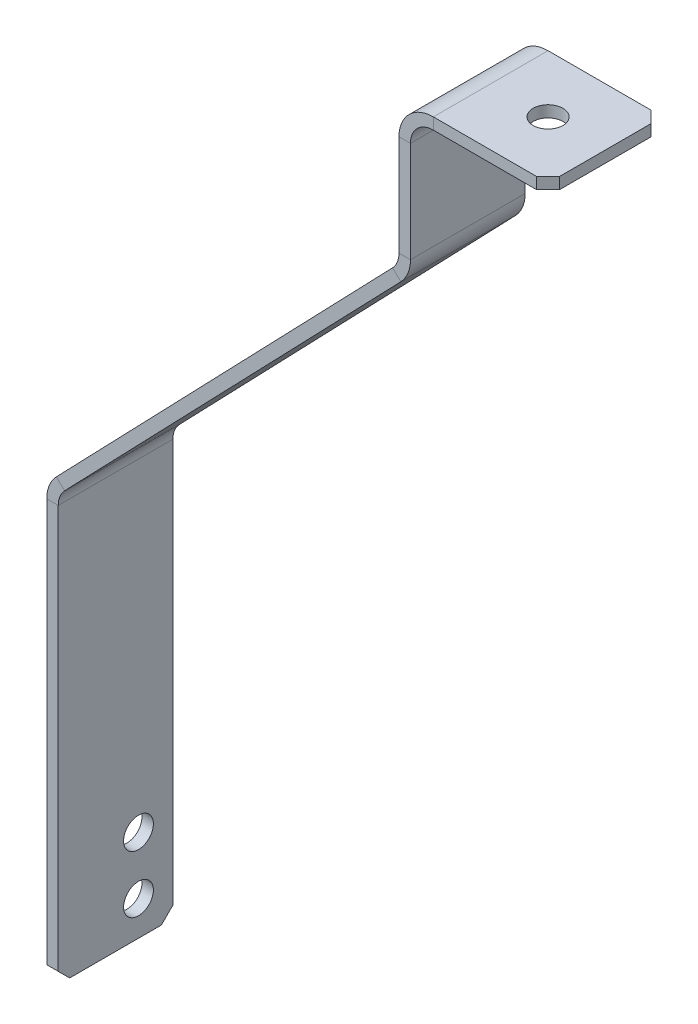
ISO-10303-21;
HEADER;
FILE_DESCRIPTION(('STEP AP214'),'2;1');
FILE_NAME('part.step','',(''),(''),'','','');
FILE_SCHEMA(('AUTOMOTIVE_DESIGN { 1 0 10303 214 1 1 1 1 }'));
ENDSEC;
DATA;
#1=APPLICATION_CONTEXT('core data for automotive mechanical design processes');
#2=APPLICATION_PROTOCOL_DEFINITION('international standard','automotive_design',2000,#1);
#3=PRODUCT_CONTEXT('',#1,'mechanical');
#4=PRODUCT('Part','Part','',(#3));
#5=PRODUCT_RELATED_PRODUCT_CATEGORY('part','',(#4));
#6=PRODUCT_DEFINITION_FORMATION('','',#4);
#7=PRODUCT_DEFINITION_CONTEXT('part definition',#1,'design');
#8=PRODUCT_DEFINITION('design','',#6,#7);
#9=PRODUCT_DEFINITION_SHAPE('','',#8);
#10=(LENGTH_UNIT() NAMED_UNIT(*) SI_UNIT(.MILLI.,.METRE.));
#11=(NAMED_UNIT(*) PLANE_ANGLE_UNIT() SI_UNIT($,.RADIAN.));
#12=(NAMED_UNIT(*) SI_UNIT($,.STERADIAN.) SOLID_ANGLE_UNIT());
#13=UNCERTAINTY_MEASURE_WITH_UNIT(LENGTH_MEASURE(1.E-05),#10,'distance_accuracy_value','');
#14=(GEOMETRIC_REPRESENTATION_CONTEXT(3) GLOBAL_UNCERTAINTY_ASSIGNED_CONTEXT((#13)) GLOBAL_UNIT_ASSIGNED_CONTEXT((#10,
#11,#12)) REPRESENTATION_CONTEXT('',''));
#15=CARTESIAN_POINT('',(0.,0.,0.));
#16=DIRECTION('',(0.,0.,1.));
#17=DIRECTION('',(1.,0.,0.));
#18=AXIS2_PLACEMENT_3D('',#15,#16,#17);
#19=CARTESIAN_POINT('',(153.6,394.5,50.));
#20=DIRECTION('',(0.,0.,1.));
#21=DIRECTION('',(1.,0.,0.));
#22=AXIS2_PLACEMENT_3D('',#19,#20,#21);
#23=PLANE('',#22);
#24=DIRECTION('',(-1.,0.,0.));
#25=VECTOR('',#24,1.);
#26=CARTESIAN_POINT('',(153.6,394.5,50.));
#27=LINE('',#26,#25);
#28=CARTESIAN_POINT('',(153.6,394.5,50.));
#29=VERTEX_POINT('',#28);
#30=CARTESIAN_POINT('',(148.6,394.5,50.));
#31=VERTEX_POINT('',#30);
#32=EDGE_CURVE('E344',#29,#31,#27,.T.);
#33=ORIENTED_EDGE('',*,*,#32,.F.);
#34=CARTESIAN_POINT('',(163.6,394.5,50.));
#35=DIRECTION('',(0.,0.,-1.));
#36=DIRECTION('',(-1.,0.,0.));
#37=AXIS2_PLACEMENT_3D('',#34,#35,#36);
#38=CIRCLE('',#37,10.);
#39=CARTESIAN_POINT('',(163.6,404.5,50.));
#40=VERTEX_POINT('',#39);
#41=EDGE_CURVE('E228',#40,#29,#38,.F.);
#42=ORIENTED_EDGE('',*,*,#41,.F.);
#43=DIRECTION('',(0.,-1.,0.));
#44=VECTOR('',#43,1.);
#45=CARTESIAN_POINT('',(163.6,409.5,50.));
#46=LINE('',#45,#44);
#47=CARTESIAN_POINT('',(163.6,409.5,50.));
#48=VERTEX_POINT('',#47);
#49=EDGE_CURVE('E341',#48,#40,#46,.T.);
#50=ORIENTED_EDGE('',*,*,#49,.F.);
#51=CARTESIAN_POINT('',(163.6,394.5,50.));
#52=DIRECTION('',(0.,0.,1.));
#53=DIRECTION('',(1.,0.,0.));
#54=AXIS2_PLACEMENT_3D('',#51,#52,#53);
#55=CIRCLE('',#54,15.);
#56=EDGE_CURVE('E235',#48,#31,#55,.T.);
#57=ORIENTED_EDGE('',*,*,#56,.T.);
#58=EDGE_LOOP('',(#33,#42,#50,#57));
#59=FACE_BOUND('',#58,.T.);
#60=ADVANCED_FACE('F47',(#59),#23,.T.);
#61=CARTESIAN_POINT('',(163.6,409.5,50.));
#62=DIRECTION('',(0.,0.,1.));
#63=DIRECTION('',(1.,0.,0.));
#64=AXIS2_PLACEMENT_3D('',#61,#62,#63);
#65=PLANE('',#64);
#66=DIRECTION('',(0.,-1.,0.));
#67=VECTOR('',#66,1.);
#68=CARTESIAN_POINT('',(153.6,404.5,50.));
#69=LINE('',#68,#67);
#70=CARTESIAN_POINT('',(153.6,350.548284887646,50.));
#71=VERTEX_POINT('',#70);
#72=EDGE_CURVE('E225',#29,#71,#69,.T.);
#73=ORIENTED_EDGE('',*,*,#72,.F.);
#74=ORIENTED_EDGE('',*,*,#32,.T.);
#75=DIRECTION('',(0.,1.,0.));
#76=VECTOR('',#75,1.);
#77=CARTESIAN_POINT('',(148.6,404.5,50.));
#78=LINE('',#77,#76);
#79=CARTESIAN_POINT('',(148.6,350.548284887646,50.));
#80=VERTEX_POINT('',#79);
#81=EDGE_CURVE('E238',#31,#80,#78,.F.);
#82=ORIENTED_EDGE('',*,*,#81,.T.);
#83=DIRECTION('',(1.,0.,0.));
#84=VECTOR('',#83,1.);
#85=CARTESIAN_POINT('',(148.6,350.548284887646,50.));
#86=LINE('',#85,#84);
#87=EDGE_CURVE('E332',#80,#71,#86,.T.);
#88=ORIENTED_EDGE('',*,*,#87,.T.);
#89=EDGE_LOOP('',(#73,#74,#82,#88));
#90=FACE_BOUND('',#89,.T.);
#91=ADVANCED_FACE('F493',(#90),#65,.T.);
#92=CARTESIAN_POINT('',(163.6,404.5,0.));
#93=DIRECTION('',(0.,0.,-1.));
#94=DIRECTION('',(-1.,0.,0.));
#95=AXIS2_PLACEMENT_3D('',#92,#93,#94);
#96=PLANE('',#95);
#97=DIRECTION('',(0.,1.,0.));
#98=VECTOR('',#97,1.);
#99=CARTESIAN_POINT('',(163.6,404.5,0.));
#100=LINE('',#99,#98);
#101=CARTESIAN_POINT('',(163.6,404.5,0.));
#102=VERTEX_POINT('',#101);
#103=CARTESIAN_POINT('',(163.6,409.5,0.));
#104=VERTEX_POINT('',#103);
#105=EDGE_CURVE('E338',#102,#104,#100,.T.);
#106=ORIENTED_EDGE('',*,*,#105,.F.);
#107=CARTESIAN_POINT('',(163.6,394.5,0.));
#108=DIRECTION('',(0.,0.,-1.));
#109=DIRECTION('',(-1.,0.,0.));
#110=AXIS2_PLACEMENT_3D('',#107,#108,#109);
#111=CIRCLE('',#110,10.);
#112=CARTESIAN_POINT('',(153.6,394.5,0.));
#113=VERTEX_POINT('',#112);
#114=EDGE_CURVE('E265',#102,#113,#111,.F.);
#115=ORIENTED_EDGE('',*,*,#114,.T.);
#116=DIRECTION('',(1.,0.,0.));
#117=VECTOR('',#116,1.);
#118=CARTESIAN_POINT('',(148.6,394.5,0.));
#119=LINE('',#118,#117);
#120=CARTESIAN_POINT('',(148.6,394.5,0.));
#121=VERTEX_POINT('',#120);
#122=EDGE_CURVE('E336',#121,#113,#119,.T.);
#123=ORIENTED_EDGE('',*,*,#122,.F.);
#124=CARTESIAN_POINT('',(163.6,394.5,0.));
#125=DIRECTION('',(0.,0.,1.));
#126=DIRECTION('',(1.,0.,0.));
#127=AXIS2_PLACEMENT_3D('',#124,#125,#126);
#128=CIRCLE('',#127,15.);
#129=EDGE_CURVE('E272',#104,#121,#128,.T.);
#130=ORIENTED_EDGE('',*,*,#129,.F.);
#131=EDGE_LOOP('',(#106,#115,#123,#130));
#132=FACE_BOUND('',#131,.T.);
#133=ADVANCED_FACE('F457',(#132),#96,.T.);
#134=CARTESIAN_POINT('',(148.6,394.5,0.));
#135=DIRECTION('',(0.,0.,-1.));
#136=DIRECTION('',(-1.,0.,0.));
#137=AXIS2_PLACEMENT_3D('',#134,#135,#136);
#138=PLANE('',#137);
#139=DIRECTION('',(-1.,0.,0.));
#140=VECTOR('',#139,1.);
#141=CARTESIAN_POINT('',(213.6,409.5,0.));
#142=LINE('',#141,#140);
#143=CARTESIAN_POINT('',(208.6,409.5,0.));
#144=VERTEX_POINT('',#143);
#145=EDGE_CURVE('E270',#144,#104,#142,.T.);
#146=ORIENTED_EDGE('',*,*,#145,.F.);
#147=DIRECTION('',(0.,-1.,0.));
#148=VECTOR('',#147,1.);
#149=CARTESIAN_POINT('',(208.6,394.5,0.));
#150=LINE('',#149,#148);
#151=CARTESIAN_POINT('',(208.6,404.5,0.));
#152=VERTEX_POINT('',#151);
#153=EDGE_CURVE('E346',#144,#152,#150,.T.);
#154=ORIENTED_EDGE('',*,*,#153,.T.);
#155=DIRECTION('',(-1.,0.,0.));
#156=VECTOR('',#155,1.);
#157=CARTESIAN_POINT('',(213.6,404.5,0.));
#158=LINE('',#157,#156);
#159=EDGE_CURVE('E268',#152,#102,#158,.T.);
#160=ORIENTED_EDGE('',*,*,#159,.T.);
#161=ORIENTED_EDGE('',*,*,#105,.T.);
#162=EDGE_LOOP('',(#146,#154,#160,#161));
#163=FACE_BOUND('',#162,.T.);
#164=ADVANCED_FACE('F451',(#163),#138,.T.);
#165=CARTESIAN_POINT('',(149.404552488393,340.143399231112,50.));
#166=DIRECTION('',(0.,0.,1.));
#167=DIRECTION('',(1.,0.,0.));
#168=AXIS2_PLACEMENT_3D('',#165,#166,#167);
#169=PLANE('',#168);
#170=DIRECTION('',(-0.72030349922622,0.693659043768956,0.));
#171=VECTOR('',#170,1.);
#172=CARTESIAN_POINT('',(149.404552488393,340.143399231112,50.));
#173=LINE('',#172,#171);
#174=CARTESIAN_POINT('',(149.404552488393,340.143399231112,50.));
#175=VERTEX_POINT('',#174);
#176=CARTESIAN_POINT('',(145.803034992262,343.611694449957,50.));
#177=VERTEX_POINT('',#176);
#178=EDGE_CURVE('E334',#175,#177,#173,.T.);
#179=ORIENTED_EDGE('',*,*,#178,.F.);
#180=CARTESIAN_POINT('',(138.6,350.548284887646,50.));
#181=DIRECTION('',(0.,0.,1.));
#182=DIRECTION('',(1.,0.,0.));
#183=AXIS2_PLACEMENT_3D('',#180,#181,#182);
#184=CIRCLE('',#183,15.);
#185=EDGE_CURVE('E219',#71,#175,#184,.F.);
#186=ORIENTED_EDGE('',*,*,#185,.F.);
#187=ORIENTED_EDGE('',*,*,#87,.F.);
#188=CARTESIAN_POINT('',(138.6,350.548284887646,50.));
#189=DIRECTION('',(0.,0.,1.));
#190=DIRECTION('',(1.,0.,0.));
#191=AXIS2_PLACEMENT_3D('',#188,#189,#190);
#192=CIRCLE('',#191,10.);
#193=EDGE_CURVE('E241',#80,#177,#192,.F.);
#194=ORIENTED_EDGE('',*,*,#193,.T.);
#195=EDGE_LOOP('',(#179,#186,#187,#194));
#196=FACE_BOUND('',#195,.T.);
#197=ADVANCED_FACE('F491',(#196),#169,.T.);
#198=CARTESIAN_POINT('',(148.6,350.548284887646,50.));
#199=DIRECTION('',(0.,0.,1.));
#200=DIRECTION('',(1.,0.,0.));
#201=AXIS2_PLACEMENT_3D('',#198,#199,#200);
#202=PLANE('',#201);
#203=DIRECTION('',(-0.693659043768952,-0.720303499226224,0.));
#204=VECTOR('',#203,1.);
#205=CARTESIAN_POINT('',(153.6,344.5,50.));
#206=LINE('',#205,#204);
#207=CARTESIAN_POINT('',(2.79696500773779,187.904400512592,50.));
#208=VERTEX_POINT('',#207);
#209=EDGE_CURVE('E217',#175,#208,#206,.T.);
#210=ORIENTED_EDGE('',*,*,#209,.F.);
#211=ORIENTED_EDGE('',*,*,#178,.T.);
#212=DIRECTION('',(-0.693659043768952,-0.720303499226224,0.));
#213=VECTOR('',#212,1.);
#214=CARTESIAN_POINT('',(149.998482503869,347.968295218845,50.));
#215=LINE('',#214,#213);
#216=CARTESIAN_POINT('',(-0.804552488393357,191.372695731437,50.));
#217=VERTEX_POINT('',#216);
#218=EDGE_CURVE('E244',#177,#217,#215,.T.);
#219=ORIENTED_EDGE('',*,*,#218,.T.);
#220=DIRECTION('',(0.720303499226224,-0.693659043768951,0.));
#221=VECTOR('',#220,1.);
#222=CARTESIAN_POINT('',(-0.804552488393357,191.372695731437,50.));
#223=LINE('',#222,#221);
#224=EDGE_CURVE('E194',#217,#208,#223,.T.);
#225=ORIENTED_EDGE('',*,*,#224,.T.);
#226=EDGE_LOOP('',(#210,#211,#219,#225));
#227=FACE_BOUND('',#226,.T.);
#228=ADVANCED_FACE('F773',(#227),#202,.T.);
#229=CARTESIAN_POINT('',(153.6,350.548284887646,0.));
#230=DIRECTION('',(0.,0.,-1.));
#231=DIRECTION('',(-1.,0.,0.));
#232=AXIS2_PLACEMENT_3D('',#229,#230,#231);
#233=PLANE('',#232);
#234=DIRECTION('',(-1.,0.,0.));
#235=VECTOR('',#234,1.);
#236=CARTESIAN_POINT('',(153.6,350.548284887646,0.));
#237=LINE('',#236,#235);
#238=CARTESIAN_POINT('',(153.6,350.548284887646,0.));
#239=VERTEX_POINT('',#238);
#240=CARTESIAN_POINT('',(148.6,350.548284887646,0.));
#241=VERTEX_POINT('',#240);
#242=EDGE_CURVE('E330',#239,#241,#237,.T.);
#243=ORIENTED_EDGE('',*,*,#242,.F.);
#244=CARTESIAN_POINT('',(138.6,350.548284887646,0.));
#245=DIRECTION('',(0.,0.,1.));
#246=DIRECTION('',(1.,0.,0.));
#247=AXIS2_PLACEMENT_3D('',#244,#245,#246);
#248=CIRCLE('',#247,15.);
#249=CARTESIAN_POINT('',(149.404552488393,340.143399231112,0.));
#250=VERTEX_POINT('',#249);
#251=EDGE_CURVE('E259',#239,#250,#248,.F.);
#252=ORIENTED_EDGE('',*,*,#251,.T.);
#253=DIRECTION('',(0.72030349922622,-0.693659043768956,0.));
#254=VECTOR('',#253,1.);
#255=CARTESIAN_POINT('',(145.803034992262,343.611694449957,0.));
#256=LINE('',#255,#254);
#257=CARTESIAN_POINT('',(145.803034992262,343.611694449957,0.));
#258=VERTEX_POINT('',#257);
#259=EDGE_CURVE('E193',#258,#250,#256,.T.);
#260=ORIENTED_EDGE('',*,*,#259,.F.);
#261=CARTESIAN_POINT('',(138.6,350.548284887646,0.));
#262=DIRECTION('',(0.,0.,1.));
#263=DIRECTION('',(1.,0.,0.));
#264=AXIS2_PLACEMENT_3D('',#261,#262,#263);
#265=CIRCLE('',#264,10.);
#266=EDGE_CURVE('E278',#241,#258,#265,.F.);
#267=ORIENTED_EDGE('',*,*,#266,.F.);
#268=EDGE_LOOP('',(#243,#252,#260,#267));
#269=FACE_BOUND('',#268,.T.);
#270=ADVANCED_FACE('F479',(#269),#233,.T.);
#271=CARTESIAN_POINT('',(145.803034992262,343.611694449957,0.));
#272=DIRECTION('',(0.,0.,-1.));
#273=DIRECTION('',(-1.,0.,0.));
#274=AXIS2_PLACEMENT_3D('',#271,#272,#273);
#275=PLANE('',#274);
#276=DIRECTION('',(0.,-1.,0.));
#277=VECTOR('',#276,1.);
#278=CARTESIAN_POINT('',(153.6,404.5,0.));
#279=LINE('',#278,#277);
#280=EDGE_CURVE('E262',#113,#239,#279,.T.);
#281=ORIENTED_EDGE('',*,*,#280,.T.);
#282=ORIENTED_EDGE('',*,*,#242,.T.);
#283=DIRECTION('',(0.,1.,0.));
#284=VECTOR('',#283,1.);
#285=CARTESIAN_POINT('',(148.6,404.5,0.));
#286=LINE('',#285,#284);
#287=EDGE_CURVE('E275',#121,#241,#286,.F.);
#288=ORIENTED_EDGE('',*,*,#287,.F.);
#289=ORIENTED_EDGE('',*,*,#122,.T.);
#290=EDGE_LOOP('',(#281,#282,#288,#289));
#291=FACE_BOUND('',#290,.T.);
#292=ADVANCED_FACE('F461',(#291),#275,.T.);
#293=CARTESIAN_POINT('',(0.,180.967810074903,50.));
#294=DIRECTION('',(0.,0.,1.));
#295=DIRECTION('',(1.,0.,0.));
#296=AXIS2_PLACEMENT_3D('',#293,#294,#295);
#297=PLANE('',#296);
#298=DIRECTION('',(-1.,0.,0.));
#299=VECTOR('',#298,1.);
#300=CARTESIAN_POINT('',(0.,180.967810074903,50.));
#301=LINE('',#300,#299);
#302=CARTESIAN_POINT('',(0.,180.967810074903,50.));
#303=VERTEX_POINT('',#302);
#304=CARTESIAN_POINT('',(-5.00000000000002,180.967810074903,50.));
#305=VERTEX_POINT('',#304);
#306=EDGE_CURVE('E184',#303,#305,#301,.T.);
#307=ORIENTED_EDGE('',*,*,#306,.F.);
#308=CARTESIAN_POINT('',(10.,180.967810074903,50.));
#309=DIRECTION('',(0.,0.,-1.));
#310=DIRECTION('',(-1.,0.,0.));
#311=AXIS2_PLACEMENT_3D('',#308,#309,#310);
#312=CIRCLE('',#311,10.);
#313=EDGE_CURVE('E188',#208,#303,#312,.F.);
#314=ORIENTED_EDGE('',*,*,#313,.F.);
#315=ORIENTED_EDGE('',*,*,#224,.F.);
#316=CARTESIAN_POINT('',(10.,180.967810074903,50.));
#317=DIRECTION('',(0.,0.,1.));
#318=DIRECTION('',(1.,0.,0.));
#319=AXIS2_PLACEMENT_3D('',#316,#317,#318);
#320=CIRCLE('',#319,15.);
#321=EDGE_CURVE('E191',#217,#305,#320,.T.);
#322=ORIENTED_EDGE('',*,*,#321,.T.);
#323=EDGE_LOOP('',(#307,#314,#315,#322));
#324=FACE_BOUND('',#323,.T.);
#325=ADVANCED_FACE('F186',(#324),#297,.T.);
#326=CARTESIAN_POINT('',(-0.804552488393357,191.372695731437,50.));
#327=DIRECTION('',(0.,0.,1.));
#328=DIRECTION('',(1.,0.,0.));
#329=AXIS2_PLACEMENT_3D('',#326,#327,#328);
#330=PLANE('',#329);
#331=DIRECTION('',(0.,-1.,0.));
#332=VECTOR('',#331,1.);
#333=CARTESIAN_POINT('',(-5.00000000000002,185.,50.));
#334=LINE('',#333,#332);
#335=CARTESIAN_POINT('',(-5.,5.,50.));
#336=VERTEX_POINT('',#335);
#337=EDGE_CURVE('E212',#305,#336,#334,.T.);
#338=ORIENTED_EDGE('',*,*,#337,.T.);
#339=DIRECTION('',(1.,0.,0.));
#340=VECTOR('',#339,1.);
#341=CARTESIAN_POINT('',(-0.804552488393357,5.,50.));
#342=LINE('',#341,#340);
#343=CARTESIAN_POINT('',(0.,5.,50.));
#344=VERTEX_POINT('',#343);
#345=EDGE_CURVE('E55',#336,#344,#342,.T.);
#346=ORIENTED_EDGE('',*,*,#345,.T.);
#347=DIRECTION('',(0.,-1.,0.));
#348=VECTOR('',#347,1.);
#349=CARTESIAN_POINT('',(0.,185.,50.));
#350=LINE('',#349,#348);
#351=EDGE_CURVE('E201',#303,#344,#350,.T.);
#352=ORIENTED_EDGE('',*,*,#351,.F.);
#353=ORIENTED_EDGE('',*,*,#306,.T.);
#354=EDGE_LOOP('',(#338,#346,#352,#353));
#355=FACE_BOUND('',#354,.T.);
#356=ADVANCED_FACE('F211',(#355),#330,.T.);
#357=CARTESIAN_POINT('',(2.79696500773779,187.904400512592,0.));
#358=DIRECTION('',(0.,0.,-1.));
#359=DIRECTION('',(-1.,0.,0.));
#360=AXIS2_PLACEMENT_3D('',#357,#358,#359);
#361=PLANE('',#360);
#362=DIRECTION('',(-0.720303499226224,0.693659043768951,0.));
#363=VECTOR('',#362,1.);
#364=CARTESIAN_POINT('',(2.79696500773779,187.904400512592,0.));
#365=LINE('',#364,#363);
#366=CARTESIAN_POINT('',(2.79696500773779,187.904400512592,0.));
#367=VERTEX_POINT('',#366);
#368=CARTESIAN_POINT('',(-0.804552488393357,191.372695731437,0.));
#369=VERTEX_POINT('',#368);
#370=EDGE_CURVE('E326',#367,#369,#365,.T.);
#371=ORIENTED_EDGE('',*,*,#370,.F.);
#372=CARTESIAN_POINT('',(10.,180.967810074903,0.));
#373=DIRECTION('',(0.,0.,-1.));
#374=DIRECTION('',(-1.,0.,0.));
#375=AXIS2_PLACEMENT_3D('',#372,#373,#374);
#376=CIRCLE('',#375,10.);
#377=CARTESIAN_POINT('',(0.,180.967810074903,0.));
#378=VERTEX_POINT('',#377);
#379=EDGE_CURVE('E254',#367,#378,#376,.F.);
#380=ORIENTED_EDGE('',*,*,#379,.T.);
#381=DIRECTION('',(1.,0.,0.));
#382=VECTOR('',#381,1.);
#383=CARTESIAN_POINT('',(-5.00000000000002,180.967810074903,0.));
#384=LINE('',#383,#382);
#385=CARTESIAN_POINT('',(-5.00000000000002,180.967810074903,0.));
#386=VERTEX_POINT('',#385);
#387=EDGE_CURVE('E324',#386,#378,#384,.T.);
#388=ORIENTED_EDGE('',*,*,#387,.F.);
#389=CARTESIAN_POINT('',(10.,180.967810074903,0.));
#390=DIRECTION('',(0.,0.,1.));
#391=DIRECTION('',(1.,0.,0.));
#392=AXIS2_PLACEMENT_3D('',#389,#390,#391);
#393=CIRCLE('',#392,15.);
#394=EDGE_CURVE('E284',#369,#386,#393,.T.);
#395=ORIENTED_EDGE('',*,*,#394,.F.);
#396=EDGE_LOOP('',(#371,#380,#388,#395));
#397=FACE_BOUND('',#396,.T.);
#398=ADVANCED_FACE('F402',(#397),#361,.T.);
#399=CARTESIAN_POINT('',(-5.00000000000002,180.967810074903,0.));
#400=DIRECTION('',(0.,0.,-1.));
#401=DIRECTION('',(-1.,0.,0.));
#402=AXIS2_PLACEMENT_3D('',#399,#400,#401);
#403=PLANE('',#402);
#404=DIRECTION('',(-0.693659043768952,-0.720303499226224,0.));
#405=VECTOR('',#404,1.);
#406=CARTESIAN_POINT('',(153.6,344.5,0.));
#407=LINE('',#406,#405);
#408=EDGE_CURVE('E256',#250,#367,#407,.T.);
#409=ORIENTED_EDGE('',*,*,#408,.T.);
#410=ORIENTED_EDGE('',*,*,#370,.T.);
#411=DIRECTION('',(-0.693659043768952,-0.720303499226224,0.));
#412=VECTOR('',#411,1.);
#413=CARTESIAN_POINT('',(149.998482503869,347.968295218845,0.));
#414=LINE('',#413,#412);
#415=EDGE_CURVE('E281',#258,#369,#414,.T.);
#416=ORIENTED_EDGE('',*,*,#415,.F.);
#417=ORIENTED_EDGE('',*,*,#259,.T.);
#418=EDGE_LOOP('',(#409,#410,#416,#417));
#419=FACE_BOUND('',#418,.T.);
#420=ADVANCED_FACE('F721',(#419),#403,.T.);
#421=CARTESIAN_POINT('',(-5.00000000000002,185.,50.));
#422=DIRECTION('',(1.,0.,0.));
#423=DIRECTION('',(0.,1.,0.));
#424=AXIS2_PLACEMENT_3D('',#421,#422,#423);
#425=PLANE('',#424);
#426=CARTESIAN_POINT('',(-5.,15.,15.));
#427=DIRECTION('',(-1.,0.,0.));
#428=DIRECTION('',(0.,-1.,0.));
#429=AXIS2_PLACEMENT_3D('',#426,#427,#428);
#430=CIRCLE('',#429,6.5);
#431=CARTESIAN_POINT('',(-5.,8.5,15.));
#432=VERTEX_POINT('',#431);
#433=EDGE_CURVE('E350',#432,#432,#430,.T.);
#434=ORIENTED_EDGE('',*,*,#433,.F.);
#435=EDGE_LOOP('',(#434));
#436=FACE_BOUND('',#435,.T.);
#437=CARTESIAN_POINT('',(-5.,40.,15.));
#438=DIRECTION('',(-1.,0.,0.));
#439=DIRECTION('',(0.,-1.,0.));
#440=AXIS2_PLACEMENT_3D('',#437,#438,#439);
#441=CIRCLE('',#440,6.5);
#442=CARTESIAN_POINT('',(-5.,33.5,15.));
#443=VERTEX_POINT('',#442);
#444=EDGE_CURVE('E407',#443,#443,#441,.T.);
#445=ORIENTED_EDGE('',*,*,#444,.F.);
#446=EDGE_LOOP('',(#445));
#447=FACE_BOUND('',#446,.T.);
#448=DIRECTION('',(0.,0.,-1.));
#449=VECTOR('',#448,1.);
#450=CARTESIAN_POINT('',(-5.,0.,50.));
#451=LINE('',#450,#449);
#452=CARTESIAN_POINT('',(-5.,0.,45.));
#453=VERTEX_POINT('',#452);
#454=CARTESIAN_POINT('',(-5.,0.,5.));
#455=VERTEX_POINT('',#454);
#456=EDGE_CURVE('E322',#453,#455,#451,.T.);
#457=ORIENTED_EDGE('',*,*,#456,.F.);
#458=DIRECTION('',(0.,-0.707106781186548,-0.707106781186547));
#459=VECTOR('',#458,1.);
#460=CARTESIAN_POINT('',(-5.,0.,45.));
#461=LINE('',#460,#459);
#462=EDGE_CURVE('E69',#453,#336,#461,.F.);
#463=ORIENTED_EDGE('',*,*,#462,.T.);
#464=ORIENTED_EDGE('',*,*,#337,.F.);
#465=DIRECTION('',(0.,0.,-1.));
#466=VECTOR('',#465,1.);
#467=CARTESIAN_POINT('',(-5.00000000000002,180.967810074903,50.));
#468=LINE('',#467,#466);
#469=EDGE_CURVE('E248',#305,#386,#468,.T.);
#470=ORIENTED_EDGE('',*,*,#469,.T.);
#471=DIRECTION('',(0.,-1.,0.));
#472=VECTOR('',#471,1.);
#473=CARTESIAN_POINT('',(-5.00000000000002,185.,0.));
#474=LINE('',#473,#472);
#475=CARTESIAN_POINT('',(-5.,5.,0.));
#476=VERTEX_POINT('',#475);
#477=EDGE_CURVE('E249',#386,#476,#474,.T.);
#478=ORIENTED_EDGE('',*,*,#477,.T.);
#479=DIRECTION('',(0.,0.707106781186548,-0.707106781186547));
#480=VECTOR('',#479,1.);
#481=CARTESIAN_POINT('',(-5.,5.,0.));
#482=LINE('',#481,#480);
#483=EDGE_CURVE('E375',#476,#455,#482,.F.);
#484=ORIENTED_EDGE('',*,*,#483,.T.);
#485=EDGE_LOOP('',(#457,#463,#464,#470,#478,#484));
#486=FACE_BOUND('',#485,.T.);
#487=ADVANCED_FACE('F391',(#436,#447,#486),#425,.F.);
#488=CARTESIAN_POINT('',(0.,0.,50.));
#489=DIRECTION('',(0.,-1.,0.));
#490=DIRECTION('',(0.,0.,-1.));
#491=AXIS2_PLACEMENT_3D('',#488,#489,#490);
#492=PLANE('',#491);
#493=DIRECTION('',(0.,0.,-1.));
#494=VECTOR('',#493,1.);
#495=CARTESIAN_POINT('',(0.,0.,50.));
#496=LINE('',#495,#494);
#497=CARTESIAN_POINT('',(0.,0.,45.));
#498=VERTEX_POINT('',#497);
#499=CARTESIAN_POINT('',(0.,0.,5.));
#500=VERTEX_POINT('',#499);
#501=EDGE_CURVE('E208',#498,#500,#496,.T.);
#502=ORIENTED_EDGE('',*,*,#501,.F.);
#503=DIRECTION('',(-1.,0.,0.));
#504=VECTOR('',#503,1.);
#505=CARTESIAN_POINT('',(0.,0.,45.));
#506=LINE('',#505,#504);
#507=EDGE_CURVE('E383',#498,#453,#506,.T.);
#508=ORIENTED_EDGE('',*,*,#507,.T.);
#509=ORIENTED_EDGE('',*,*,#456,.T.);
#510=DIRECTION('',(1.,0.,0.));
#511=VECTOR('',#510,1.);
#512=CARTESIAN_POINT('',(0.,0.,5.));
#513=LINE('',#512,#511);
#514=EDGE_CURVE('E378',#455,#500,#513,.T.);
#515=ORIENTED_EDGE('',*,*,#514,.T.);
#516=EDGE_LOOP('',(#502,#508,#509,#515));
#517=FACE_BOUND('',#516,.T.);
#518=ADVANCED_FACE('F389',(#517),#492,.T.);
#519=CARTESIAN_POINT('',(0.,185.,50.));
#520=DIRECTION('',(1.,0.,0.));
#521=DIRECTION('',(0.,1.,0.));
#522=AXIS2_PLACEMENT_3D('',#519,#520,#521);
#523=PLANE('',#522);
#524=CARTESIAN_POINT('',(0.,15.,15.));
#525=DIRECTION('',(1.,0.,0.));
#526=DIRECTION('',(0.,1.,0.));
#527=AXIS2_PLACEMENT_3D('',#524,#525,#526);
#528=CIRCLE('',#527,6.5);
#529=CARTESIAN_POINT('',(0.,21.5,15.));
#530=VERTEX_POINT('',#529);
#531=EDGE_CURVE('E252',#530,#530,#528,.T.);
#532=ORIENTED_EDGE('',*,*,#531,.F.);
#533=EDGE_LOOP('',(#532));
#534=FACE_BOUND('',#533,.T.);
#535=CARTESIAN_POINT('',(0.,40.,15.));
#536=DIRECTION('',(1.,0.,0.));
#537=DIRECTION('',(0.,1.,0.));
#538=AXIS2_PLACEMENT_3D('',#535,#536,#537);
#539=CIRCLE('',#538,6.5);
#540=CARTESIAN_POINT('',(0.,46.5,15.));
#541=VERTEX_POINT('',#540);
#542=EDGE_CURVE('E347',#541,#541,#539,.T.);
#543=ORIENTED_EDGE('',*,*,#542,.F.);
#544=EDGE_LOOP('',(#543));
#545=FACE_BOUND('',#544,.T.);
#546=ORIENTED_EDGE('',*,*,#351,.T.);
#547=DIRECTION('',(0.,0.707106781186548,0.707106781186547));
#548=VECTOR('',#547,1.);
#549=CARTESIAN_POINT('',(0.,95.0000000000001,140.));
#550=LINE('',#549,#548);
#551=EDGE_CURVE('E11',#344,#498,#550,.F.);
#552=ORIENTED_EDGE('',*,*,#551,.T.);
#553=ORIENTED_EDGE('',*,*,#501,.T.);
#554=DIRECTION('',(0.,-0.707106781186548,0.707106781186547));
#555=VECTOR('',#554,1.);
#556=CARTESIAN_POINT('',(0.,70.0000000000001,-65.));
#557=LINE('',#556,#555);
#558=CARTESIAN_POINT('',(0.,5.,0.));
#559=VERTEX_POINT('',#558);
#560=EDGE_CURVE('E381',#500,#559,#557,.F.);
#561=ORIENTED_EDGE('',*,*,#560,.T.);
#562=DIRECTION('',(0.,-1.,0.));
#563=VECTOR('',#562,1.);
#564=CARTESIAN_POINT('',(0.,185.,0.));
#565=LINE('',#564,#563);
#566=EDGE_CURVE('E204',#378,#559,#565,.T.);
#567=ORIENTED_EDGE('',*,*,#566,.F.);
#568=DIRECTION('',(0.,0.,-1.));
#569=VECTOR('',#568,1.);
#570=CARTESIAN_POINT('',(0.,180.967810074903,50.));
#571=LINE('',#570,#569);
#572=EDGE_CURVE('E199',#303,#378,#571,.T.);
#573=ORIENTED_EDGE('',*,*,#572,.F.);
#574=EDGE_LOOP('',(#546,#552,#553,#561,#567,#573));
#575=FACE_BOUND('',#574,.T.);
#576=ADVANCED_FACE('F200',(#534,#545,#575),#523,.T.);
#577=CARTESIAN_POINT('',(10.,180.967810074903,50.));
#578=DIRECTION('',(0.,0.,-1.));
#579=DIRECTION('',(-1.,0.,0.));
#580=AXIS2_PLACEMENT_3D('',#577,#578,#579);
#581=CYLINDRICAL_SURFACE('',#580,10.);
#582=ORIENTED_EDGE('',*,*,#379,.F.);
#583=DIRECTION('',(0.,0.,-1.));
#584=VECTOR('',#583,1.);
#585=CARTESIAN_POINT('',(2.79696500773779,187.904400512592,50.));
#586=LINE('',#585,#584);
#587=EDGE_CURVE('E209',#208,#367,#586,.T.);
#588=ORIENTED_EDGE('',*,*,#587,.F.);
#589=ORIENTED_EDGE('',*,*,#313,.T.);
#590=ORIENTED_EDGE('',*,*,#572,.T.);
#591=EDGE_LOOP('',(#582,#588,#589,#590));
#592=FACE_BOUND('',#591,.T.);
#593=ADVANCED_FACE('F215',(#592),#581,.F.);
#594=CARTESIAN_POINT('',(153.6,344.5,50.));
#595=DIRECTION('',(0.720303499226224,-0.693659043768952,0.));
#596=DIRECTION('',(0.693659043768952,0.720303499226224,0.));
#597=AXIS2_PLACEMENT_3D('',#594,#595,#596);
#598=PLANE('',#597);
#599=ORIENTED_EDGE('',*,*,#408,.F.);
#600=DIRECTION('',(0.,0.,-1.));
#601=VECTOR('',#600,1.);
#602=CARTESIAN_POINT('',(149.404552488393,340.143399231112,50.));
#603=LINE('',#602,#601);
#604=EDGE_CURVE('E317',#175,#250,#603,.T.);
#605=ORIENTED_EDGE('',*,*,#604,.F.);
#606=ORIENTED_EDGE('',*,*,#209,.T.);
#607=ORIENTED_EDGE('',*,*,#587,.T.);
#608=EDGE_LOOP('',(#599,#605,#606,#607));
#609=FACE_BOUND('',#608,.T.);
#610=ADVANCED_FACE('F677',(#609),#598,.T.);
#611=CARTESIAN_POINT('',(138.6,350.548284887646,50.));
#612=DIRECTION('',(0.,0.,-1.));
#613=DIRECTION('',(-1.,0.,0.));
#614=AXIS2_PLACEMENT_3D('',#611,#612,#613);
#615=CYLINDRICAL_SURFACE('',#614,15.);
#616=ORIENTED_EDGE('',*,*,#251,.F.);
#617=DIRECTION('',(0.,0.,-1.));
#618=VECTOR('',#617,1.);
#619=CARTESIAN_POINT('',(153.6,350.548284887646,50.));
#620=LINE('',#619,#618);
#621=EDGE_CURVE('E314',#71,#239,#620,.T.);
#622=ORIENTED_EDGE('',*,*,#621,.F.);
#623=ORIENTED_EDGE('',*,*,#185,.T.);
#624=ORIENTED_EDGE('',*,*,#604,.T.);
#625=EDGE_LOOP('',(#616,#622,#623,#624));
#626=FACE_BOUND('',#625,.T.);
#627=ADVANCED_FACE('F475',(#626),#615,.T.);
#628=CARTESIAN_POINT('',(153.6,404.5,50.));
#629=DIRECTION('',(1.,0.,0.));
#630=DIRECTION('',(0.,0.,-1.));
#631=AXIS2_PLACEMENT_3D('',#628,#629,#630);
#632=PLANE('',#631);
#633=ORIENTED_EDGE('',*,*,#280,.F.);
#634=DIRECTION('',(0.,0.,-1.));
#635=VECTOR('',#634,1.);
#636=CARTESIAN_POINT('',(153.6,394.5,50.));
#637=LINE('',#636,#635);
#638=EDGE_CURVE('E311',#29,#113,#637,.T.);
#639=ORIENTED_EDGE('',*,*,#638,.F.);
#640=ORIENTED_EDGE('',*,*,#72,.T.);
#641=ORIENTED_EDGE('',*,*,#621,.T.);
#642=EDGE_LOOP('',(#633,#639,#640,#641));
#643=FACE_BOUND('',#642,.T.);
#644=ADVANCED_FACE('F470',(#643),#632,.T.);
#645=CARTESIAN_POINT('',(163.6,394.5,50.));
#646=DIRECTION('',(0.,0.,-1.));
#647=DIRECTION('',(-1.,0.,0.));
#648=AXIS2_PLACEMENT_3D('',#645,#646,#647);
#649=CYLINDRICAL_SURFACE('',#648,10.);
#650=ORIENTED_EDGE('',*,*,#114,.F.);
#651=DIRECTION('',(0.,0.,-1.));
#652=VECTOR('',#651,1.);
#653=CARTESIAN_POINT('',(163.6,404.5,50.));
#654=LINE('',#653,#652);
#655=EDGE_CURVE('E308',#40,#102,#654,.T.);
#656=ORIENTED_EDGE('',*,*,#655,.F.);
#657=ORIENTED_EDGE('',*,*,#41,.T.);
#658=ORIENTED_EDGE('',*,*,#638,.T.);
#659=EDGE_LOOP('',(#650,#656,#657,#658));
#660=FACE_BOUND('',#659,.T.);
#661=ADVANCED_FACE('F465',(#660),#649,.F.);
#662=CARTESIAN_POINT('',(213.6,404.5,50.));
#663=DIRECTION('',(0.,-1.,0.));
#664=DIRECTION('',(1.,0.,0.));
#665=AXIS2_PLACEMENT_3D('',#662,#663,#664);
#666=PLANE('',#665);
#667=CARTESIAN_POINT('',(188.6,404.5,25.));
#668=DIRECTION('',(0.,-1.,0.));
#669=DIRECTION('',(1.,0.,0.));
#670=AXIS2_PLACEMENT_3D('',#667,#668,#669);
#671=CIRCLE('',#670,6.50000000000002);
#672=CARTESIAN_POINT('',(195.1,404.5,25.));
#673=VERTEX_POINT('',#672);
#674=EDGE_CURVE('E410',#673,#673,#671,.T.);
#675=ORIENTED_EDGE('',*,*,#674,.F.);
#676=EDGE_LOOP('',(#675));
#677=FACE_BOUND('',#676,.T.);
#678=DIRECTION('',(0.,0.,-1.));
#679=VECTOR('',#678,1.);
#680=CARTESIAN_POINT('',(213.6,404.5,50.));
#681=LINE('',#680,#679);
#682=CARTESIAN_POINT('',(213.6,404.5,45.));
#683=VERTEX_POINT('',#682);
#684=CARTESIAN_POINT('',(213.6,404.5,5.));
#685=VERTEX_POINT('',#684);
#686=EDGE_CURVE('E306',#683,#685,#681,.T.);
#687=ORIENTED_EDGE('',*,*,#686,.F.);
#688=DIRECTION('',(-0.707106781186548,0.,0.707106781186547));
#689=VECTOR('',#688,1.);
#690=CARTESIAN_POINT('',(211.1,404.5,47.5));
#691=LINE('',#690,#689);
#692=CARTESIAN_POINT('',(208.6,404.5,50.));
#693=VERTEX_POINT('',#692);
#694=EDGE_CURVE('E366',#683,#693,#691,.T.);
#695=ORIENTED_EDGE('',*,*,#694,.T.);
#696=DIRECTION('',(-1.,0.,0.));
#697=VECTOR('',#696,1.);
#698=CARTESIAN_POINT('',(213.6,404.5,50.));
#699=LINE('',#698,#697);
#700=EDGE_CURVE('E231',#693,#40,#699,.T.);
#701=ORIENTED_EDGE('',*,*,#700,.T.);
#702=ORIENTED_EDGE('',*,*,#655,.T.);
#703=ORIENTED_EDGE('',*,*,#159,.F.);
#704=DIRECTION('',(-0.707106781186548,0.,-0.707106781186547));
#705=VECTOR('',#704,1.);
#706=CARTESIAN_POINT('',(236.1,404.5,27.5));
#707=LINE('',#706,#705);
#708=EDGE_CURVE('E355',#152,#685,#707,.F.);
#709=ORIENTED_EDGE('',*,*,#708,.T.);
#710=EDGE_LOOP('',(#687,#695,#701,#702,#703,#709));
#711=FACE_BOUND('',#710,.T.);
#712=ADVANCED_FACE('F441',(#677,#711),#666,.T.);
#713=CARTESIAN_POINT('',(213.6,409.5,50.));
#714=DIRECTION('',(1.,0.,0.));
#715=DIRECTION('',(0.,0.,-1.));
#716=AXIS2_PLACEMENT_3D('',#713,#714,#715);
#717=PLANE('',#716);
#718=DIRECTION('',(0.,0.,-1.));
#719=VECTOR('',#718,1.);
#720=CARTESIAN_POINT('',(213.6,409.5,50.));
#721=LINE('',#720,#719);
#722=CARTESIAN_POINT('',(213.6,409.5,45.));
#723=VERTEX_POINT('',#722);
#724=CARTESIAN_POINT('',(213.6,409.5,5.));
#725=VERTEX_POINT('',#724);
#726=EDGE_CURVE('E304',#723,#725,#721,.T.);
#727=ORIENTED_EDGE('',*,*,#726,.F.);
#728=DIRECTION('',(0.,-1.,0.));
#729=VECTOR('',#728,1.);
#730=CARTESIAN_POINT('',(213.6,404.5,45.));
#731=LINE('',#730,#729);
#732=EDGE_CURVE('E363',#723,#683,#731,.T.);
#733=ORIENTED_EDGE('',*,*,#732,.T.);
#734=ORIENTED_EDGE('',*,*,#686,.T.);
#735=DIRECTION('',(0.,1.,0.));
#736=VECTOR('',#735,1.);
#737=CARTESIAN_POINT('',(213.6,409.5,5.));
#738=LINE('',#737,#736);
#739=EDGE_CURVE('E358',#685,#725,#738,.T.);
#740=ORIENTED_EDGE('',*,*,#739,.T.);
#741=EDGE_LOOP('',(#727,#733,#734,#740));
#742=FACE_BOUND('',#741,.T.);
#743=ADVANCED_FACE('F425',(#742),#717,.T.);
#744=CARTESIAN_POINT('',(213.6,409.5,50.));
#745=DIRECTION('',(0.,-1.,0.));
#746=DIRECTION('',(1.,0.,0.));
#747=AXIS2_PLACEMENT_3D('',#744,#745,#746);
#748=PLANE('',#747);
#749=CARTESIAN_POINT('',(188.6,409.5,25.));
#750=DIRECTION('',(0.,1.,0.));
#751=DIRECTION('',(-1.,0.,0.));
#752=AXIS2_PLACEMENT_3D('',#749,#750,#751);
#753=CIRCLE('',#752,6.50000000000002);
#754=CARTESIAN_POINT('',(182.1,409.5,25.));
#755=VERTEX_POINT('',#754);
#756=EDGE_CURVE('E415',#755,#755,#753,.T.);
#757=ORIENTED_EDGE('',*,*,#756,.F.);
#758=EDGE_LOOP('',(#757));
#759=FACE_BOUND('',#758,.T.);
#760=DIRECTION('',(-1.,0.,0.));
#761=VECTOR('',#760,1.);
#762=CARTESIAN_POINT('',(213.6,409.5,50.));
#763=LINE('',#762,#761);
#764=CARTESIAN_POINT('',(208.6,409.5,50.));
#765=VERTEX_POINT('',#764);
#766=EDGE_CURVE('E233',#765,#48,#763,.T.);
#767=ORIENTED_EDGE('',*,*,#766,.F.);
#768=DIRECTION('',(0.707106781186548,0.,-0.707106781186547));
#769=VECTOR('',#768,1.);
#770=CARTESIAN_POINT('',(213.6,409.5,45.));
#771=LINE('',#770,#769);
#772=EDGE_CURVE('E370',#765,#723,#771,.T.);
#773=ORIENTED_EDGE('',*,*,#772,.T.);
#774=ORIENTED_EDGE('',*,*,#726,.T.);
#775=DIRECTION('',(0.707106781186548,0.,0.707106781186547));
#776=VECTOR('',#775,1.);
#777=CARTESIAN_POINT('',(208.6,409.5,0.));
#778=LINE('',#777,#776);
#779=EDGE_CURVE('E361',#725,#144,#778,.F.);
#780=ORIENTED_EDGE('',*,*,#779,.T.);
#781=ORIENTED_EDGE('',*,*,#145,.T.);
#782=DIRECTION('',(0.,0.,-1.));
#783=VECTOR('',#782,1.);
#784=CARTESIAN_POINT('',(163.6,409.5,50.));
#785=LINE('',#784,#783);
#786=EDGE_CURVE('E301',#48,#104,#785,.T.);
#787=ORIENTED_EDGE('',*,*,#786,.F.);
#788=EDGE_LOOP('',(#767,#773,#774,#780,#781,#787));
#789=FACE_BOUND('',#788,.T.);
#790=ADVANCED_FACE('F421',(#759,#789),#748,.F.);
#791=CARTESIAN_POINT('',(163.6,394.5,50.));
#792=DIRECTION('',(0.,0.,-1.));
#793=DIRECTION('',(-1.,0.,0.));
#794=AXIS2_PLACEMENT_3D('',#791,#792,#793);
#795=CYLINDRICAL_SURFACE('',#794,15.);
#796=ORIENTED_EDGE('',*,*,#129,.T.);
#797=DIRECTION('',(0.,0.,-1.));
#798=VECTOR('',#797,1.);
#799=CARTESIAN_POINT('',(148.6,394.5,50.));
#800=LINE('',#799,#798);
#801=EDGE_CURVE('E298',#31,#121,#800,.T.);
#802=ORIENTED_EDGE('',*,*,#801,.F.);
#803=ORIENTED_EDGE('',*,*,#56,.F.);
#804=ORIENTED_EDGE('',*,*,#786,.T.);
#805=EDGE_LOOP('',(#796,#802,#803,#804));
#806=FACE_BOUND('',#805,.T.);
#807=ADVANCED_FACE('F424',(#806),#795,.T.);
#808=CARTESIAN_POINT('',(148.6,404.5,50.));
#809=DIRECTION('',(1.,0.,0.));
#810=DIRECTION('',(0.,0.,-1.));
#811=AXIS2_PLACEMENT_3D('',#808,#809,#810);
#812=PLANE('',#811);
#813=ORIENTED_EDGE('',*,*,#287,.T.);
#814=DIRECTION('',(0.,0.,-1.));
#815=VECTOR('',#814,1.);
#816=CARTESIAN_POINT('',(148.6,350.548284887646,50.));
#817=LINE('',#816,#815);
#818=EDGE_CURVE('E295',#80,#241,#817,.T.);
#819=ORIENTED_EDGE('',*,*,#818,.F.);
#820=ORIENTED_EDGE('',*,*,#81,.F.);
#821=ORIENTED_EDGE('',*,*,#801,.T.);
#822=EDGE_LOOP('',(#813,#819,#820,#821));
#823=FACE_BOUND('',#822,.T.);
#824=ADVANCED_FACE('F483',(#823),#812,.F.);
#825=CARTESIAN_POINT('',(138.6,350.548284887646,50.));
#826=DIRECTION('',(0.,0.,-1.));
#827=DIRECTION('',(-1.,0.,0.));
#828=AXIS2_PLACEMENT_3D('',#825,#826,#827);
#829=CYLINDRICAL_SURFACE('',#828,10.);
#830=ORIENTED_EDGE('',*,*,#266,.T.);
#831=DIRECTION('',(0.,0.,-1.));
#832=VECTOR('',#831,1.);
#833=CARTESIAN_POINT('',(145.803034992262,343.611694449957,50.));
#834=LINE('',#833,#832);
#835=EDGE_CURVE('E292',#177,#258,#834,.T.);
#836=ORIENTED_EDGE('',*,*,#835,.F.);
#837=ORIENTED_EDGE('',*,*,#193,.F.);
#838=ORIENTED_EDGE('',*,*,#818,.T.);
#839=EDGE_LOOP('',(#830,#836,#837,#838));
#840=FACE_BOUND('',#839,.T.);
#841=ADVANCED_FACE('F487',(#840),#829,.F.);
#842=CARTESIAN_POINT('',(149.998482503869,347.968295218845,50.));
#843=DIRECTION('',(0.720303499226224,-0.693659043768952,0.));
#844=DIRECTION('',(0.693659043768952,0.720303499226224,0.));
#845=AXIS2_PLACEMENT_3D('',#842,#843,#844);
#846=PLANE('',#845);
#847=ORIENTED_EDGE('',*,*,#415,.T.);
#848=DIRECTION('',(0.,0.,-1.));
#849=VECTOR('',#848,1.);
#850=CARTESIAN_POINT('',(-0.804552488393357,191.372695731437,50.));
#851=LINE('',#850,#849);
#852=EDGE_CURVE('E289',#217,#369,#851,.T.);
#853=ORIENTED_EDGE('',*,*,#852,.F.);
#854=ORIENTED_EDGE('',*,*,#218,.F.);
#855=ORIENTED_EDGE('',*,*,#835,.T.);
#856=EDGE_LOOP('',(#847,#853,#854,#855));
#857=FACE_BOUND('',#856,.T.);
#858=ADVANCED_FACE('F504',(#857),#846,.F.);
#859=CARTESIAN_POINT('',(10.,180.967810074903,50.));
#860=DIRECTION('',(0.,0.,-1.));
#861=DIRECTION('',(-1.,0.,0.));
#862=AXIS2_PLACEMENT_3D('',#859,#860,#861);
#863=CYLINDRICAL_SURFACE('',#862,15.);
#864=ORIENTED_EDGE('',*,*,#394,.T.);
#865=ORIENTED_EDGE('',*,*,#469,.F.);
#866=ORIENTED_EDGE('',*,*,#321,.F.);
#867=ORIENTED_EDGE('',*,*,#852,.T.);
#868=EDGE_LOOP('',(#864,#865,#866,#867));
#869=FACE_BOUND('',#868,.T.);
#870=ADVANCED_FACE('F404',(#869),#863,.T.);
#871=CARTESIAN_POINT('',(10.,180.967810074903,50.));
#872=DIRECTION('',(0.,0.,-1.));
#873=DIRECTION('',(-1.,0.,0.));
#874=AXIS2_PLACEMENT_3D('',#871,#872,#873);
#875=PLANE('',#874);
#876=ORIENTED_EDGE('',*,*,#700,.F.);
#877=DIRECTION('',(0.,1.,0.));
#878=VECTOR('',#877,1.);
#879=CARTESIAN_POINT('',(208.6,409.5,50.));
#880=LINE('',#879,#878);
#881=EDGE_CURVE('E368',#693,#765,#880,.T.);
#882=ORIENTED_EDGE('',*,*,#881,.T.);
#883=ORIENTED_EDGE('',*,*,#766,.T.);
#884=ORIENTED_EDGE('',*,*,#49,.T.);
#885=EDGE_LOOP('',(#876,#882,#883,#884));
#886=FACE_BOUND('',#885,.T.);
#887=ADVANCED_FACE('F495',(#886),#875,.F.);
#888=CARTESIAN_POINT('',(10.,180.967810074903,0.));
#889=DIRECTION('',(0.,0.,-1.));
#890=DIRECTION('',(-1.,0.,0.));
#891=AXIS2_PLACEMENT_3D('',#888,#889,#890);
#892=PLANE('',#891);
#893=ORIENTED_EDGE('',*,*,#566,.T.);
#894=DIRECTION('',(-1.,0.,0.));
#895=VECTOR('',#894,1.);
#896=CARTESIAN_POINT('',(10.,5.,0.));
#897=LINE('',#896,#895);
#898=EDGE_CURVE('E372',#559,#476,#897,.T.);
#899=ORIENTED_EDGE('',*,*,#898,.T.);
#900=ORIENTED_EDGE('',*,*,#477,.F.);
#901=ORIENTED_EDGE('',*,*,#387,.T.);
#902=EDGE_LOOP('',(#893,#899,#900,#901));
#903=FACE_BOUND('',#902,.T.);
#904=ADVANCED_FACE('F399',(#903),#892,.T.);
#905=CARTESIAN_POINT('',(5.,40.,15.));
#906=DIRECTION('',(-1.,0.,0.));
#907=DIRECTION('',(0.,-1.,0.));
#908=AXIS2_PLACEMENT_3D('',#905,#906,#907);
#909=CYLINDRICAL_SURFACE('',#908,6.5);
#910=ORIENTED_EDGE('',*,*,#542,.T.);
#911=EDGE_LOOP('',(#910));
#912=FACE_BOUND('',#911,.T.);
#913=ORIENTED_EDGE('',*,*,#444,.T.);
#914=EDGE_LOOP('',(#913));
#915=FACE_BOUND('',#914,.T.);
#916=ADVANCED_FACE('F501',(#912,#915),#909,.F.);
#917=CARTESIAN_POINT('',(5.,15.,15.));
#918=DIRECTION('',(-1.,0.,0.));
#919=DIRECTION('',(0.,-1.,0.));
#920=AXIS2_PLACEMENT_3D('',#917,#918,#919);
#921=CYLINDRICAL_SURFACE('',#920,6.5);
#922=ORIENTED_EDGE('',*,*,#531,.T.);
#923=EDGE_LOOP('',(#922));
#924=FACE_BOUND('',#923,.T.);
#925=ORIENTED_EDGE('',*,*,#433,.T.);
#926=EDGE_LOOP('',(#925));
#927=FACE_BOUND('',#926,.T.);
#928=ADVANCED_FACE('F551',(#924,#927),#921,.F.);
#929=CARTESIAN_POINT('',(188.6,399.5,25.));
#930=DIRECTION('',(0.,1.,0.));
#931=DIRECTION('',(-1.,0.,0.));
#932=AXIS2_PLACEMENT_3D('',#929,#930,#931);
#933=CYLINDRICAL_SURFACE('',#932,6.50000000000002);
#934=ORIENTED_EDGE('',*,*,#674,.T.);
#935=EDGE_LOOP('',(#934));
#936=FACE_BOUND('',#935,.T.);
#937=ORIENTED_EDGE('',*,*,#756,.T.);
#938=EDGE_LOOP('',(#937));
#939=FACE_BOUND('',#938,.T.);
#940=ADVANCED_FACE('F419',(#936,#939),#933,.F.);
#941=CARTESIAN_POINT('',(208.6,394.5,0.));
#942=DIRECTION('',(-0.707106781186547,0.,0.707106781186548));
#943=DIRECTION('',(0.,-1.,0.));
#944=AXIS2_PLACEMENT_3D('',#941,#942,#943);
#945=PLANE('',#944);
#946=ORIENTED_EDGE('',*,*,#779,.F.);
#947=ORIENTED_EDGE('',*,*,#739,.F.);
#948=ORIENTED_EDGE('',*,*,#708,.F.);
#949=ORIENTED_EDGE('',*,*,#153,.F.);
#950=EDGE_LOOP('',(#946,#947,#948,#949));
#951=FACE_BOUND('',#950,.T.);
#952=ADVANCED_FACE('F448',(#951),#945,.F.);
#953=CARTESIAN_POINT('',(213.6,409.5,45.));
#954=DIRECTION('',(0.707106781186547,0.,0.707106781186548));
#955=DIRECTION('',(0.,1.,0.));
#956=AXIS2_PLACEMENT_3D('',#953,#954,#955);
#957=PLANE('',#956);
#958=ORIENTED_EDGE('',*,*,#772,.F.);
#959=ORIENTED_EDGE('',*,*,#881,.F.);
#960=ORIENTED_EDGE('',*,*,#694,.F.);
#961=ORIENTED_EDGE('',*,*,#732,.F.);
#962=EDGE_LOOP('',(#958,#959,#960,#961));
#963=FACE_BOUND('',#962,.T.);
#964=ADVANCED_FACE('F437',(#963),#957,.T.);
#965=CARTESIAN_POINT('',(10.,5.,0.));
#966=DIRECTION('',(0.,0.707106781186547,0.707106781186548));
#967=DIRECTION('',(-1.,0.,0.));
#968=AXIS2_PLACEMENT_3D('',#965,#966,#967);
#969=PLANE('',#968);
#970=ORIENTED_EDGE('',*,*,#560,.F.);
#971=ORIENTED_EDGE('',*,*,#514,.F.);
#972=ORIENTED_EDGE('',*,*,#483,.F.);
#973=ORIENTED_EDGE('',*,*,#898,.F.);
#974=EDGE_LOOP('',(#970,#971,#972,#973));
#975=FACE_BOUND('',#974,.T.);
#976=ADVANCED_FACE('F397',(#975),#969,.F.);
#977=CARTESIAN_POINT('',(0.,0.,45.));
#978=DIRECTION('',(0.,0.707106781186547,-0.707106781186548));
#979=DIRECTION('',(-1.,0.,0.));
#980=AXIS2_PLACEMENT_3D('',#977,#978,#979);
#981=PLANE('',#980);
#982=ORIENTED_EDGE('',*,*,#551,.F.);
#983=ORIENTED_EDGE('',*,*,#345,.F.);
#984=ORIENTED_EDGE('',*,*,#462,.F.);
#985=ORIENTED_EDGE('',*,*,#507,.F.);
#986=EDGE_LOOP('',(#982,#983,#984,#985));
#987=FACE_BOUND('',#986,.T.);
#988=ADVANCED_FACE('F49',(#987),#981,.F.);
#989=CLOSED_SHELL('',(#60,#91,#133,#164,#197,#228,#270,#292,#325,#356,#398,#420,#487,#518,#576,
#593,#610,#627,#644,#661,#712,#743,#790,#807,#824,#841,#858,#870,#887,#904,#916,#928,#940,#952,
#964,#976,#988));
#990=MANIFOLD_SOLID_BREP('B2',#989);
#991=ADVANCED_BREP_SHAPE_REPRESENTATION('',(#18,#990),#14);
#992=SHAPE_DEFINITION_REPRESENTATION(#9,#991);
ENDSEC;
END-ISO-10303-21;
